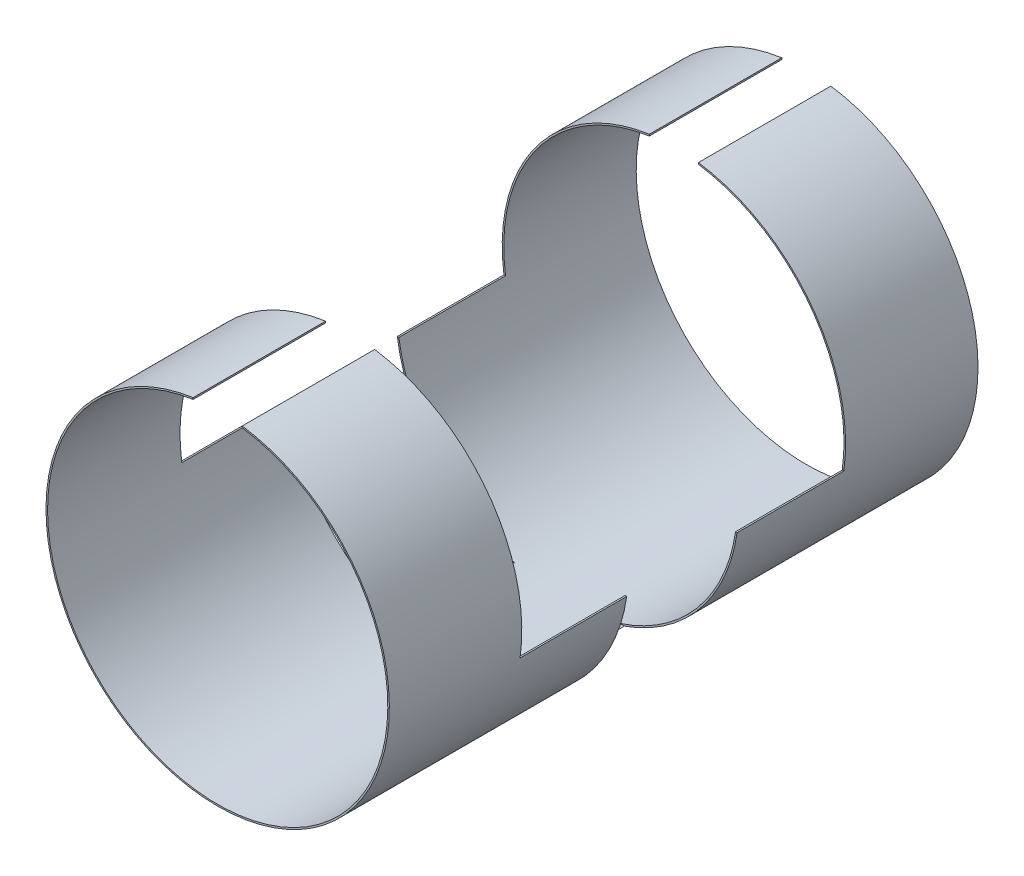
ISO-10303-21;
HEADER;
FILE_DESCRIPTION(('STEP AP214'),'2;1');
FILE_NAME('part.step','',(''),(''),'','','');
FILE_SCHEMA(('AUTOMOTIVE_DESIGN { 1 0 10303 214 1 1 1 1 }'));
ENDSEC;
DATA;
#1=APPLICATION_CONTEXT('core data for automotive mechanical design processes');
#2=APPLICATION_PROTOCOL_DEFINITION('international standard','automotive_design',2000,#1);
#3=PRODUCT_CONTEXT('',#1,'mechanical');
#4=PRODUCT('Part','Part','',(#3));
#5=PRODUCT_RELATED_PRODUCT_CATEGORY('part','',(#4));
#6=PRODUCT_DEFINITION_FORMATION('','',#4);
#7=PRODUCT_DEFINITION_CONTEXT('part definition',#1,'design');
#8=PRODUCT_DEFINITION('design','',#6,#7);
#9=PRODUCT_DEFINITION_SHAPE('','',#8);
#10=(LENGTH_UNIT() NAMED_UNIT(*) SI_UNIT(.MILLI.,.METRE.));
#11=(NAMED_UNIT(*) PLANE_ANGLE_UNIT() SI_UNIT($,.RADIAN.));
#12=(NAMED_UNIT(*) SI_UNIT($,.STERADIAN.) SOLID_ANGLE_UNIT());
#13=UNCERTAINTY_MEASURE_WITH_UNIT(LENGTH_MEASURE(1.E-05),#10,'distance_accuracy_value','');
#14=(GEOMETRIC_REPRESENTATION_CONTEXT(3) GLOBAL_UNCERTAINTY_ASSIGNED_CONTEXT((#13)) GLOBAL_UNIT_ASSIGNED_CONTEXT((#10,
#11,#12)) REPRESENTATION_CONTEXT('',''));
#15=CARTESIAN_POINT('',(0.,0.,0.));
#16=DIRECTION('',(0.,0.,1.));
#17=DIRECTION('',(1.,0.,0.));
#18=AXIS2_PLACEMENT_3D('',#15,#16,#17);
#19=CARTESIAN_POINT('',(-152.4,-6.34999999999999,118.11));
#20=DIRECTION('',(0.,-1.,0.));
#21=DIRECTION('',(0.,0.,-1.));
#22=AXIS2_PLACEMENT_3D('',#19,#20,#21);
#23=PLANE('',#22);
#24=DIRECTION('',(0.,0.,-1.));
#25=VECTOR('',#24,1.);
#26=CARTESIAN_POINT('',(43.9940905122495,-6.34999999999999,152.4));
#27=LINE('',#26,#25);
#28=CARTESIAN_POINT('',(43.9940905122494,-6.34999999999999,90.4875));
#29=VERTEX_POINT('',#28);
#30=CARTESIAN_POINT('',(43.9940905122494,-6.34999999999999,118.11));
#31=VERTEX_POINT('',#30);
#32=EDGE_CURVE('E197',#29,#31,#27,.F.);
#33=ORIENTED_EDGE('',*,*,#32,.F.);
#34=DIRECTION('',(1.,0.,0.));
#35=VECTOR('',#34,1.);
#36=CARTESIAN_POINT('',(-152.4,-6.34999999999999,90.4875));
#37=LINE('',#36,#35);
#38=CARTESIAN_POINT('',(43.5834395264989,-6.34999999999999,90.4875));
#39=VERTEX_POINT('',#38);
#40=EDGE_CURVE('E327',#39,#29,#37,.T.);
#41=ORIENTED_EDGE('',*,*,#40,.F.);
#42=DIRECTION('',(0.,0.,-1.));
#43=VECTOR('',#42,1.);
#44=CARTESIAN_POINT('',(43.583439526499,-6.34999999999999,152.4));
#45=LINE('',#44,#43);
#46=CARTESIAN_POINT('',(43.583439526499,-6.34999999999999,118.11));
#47=VERTEX_POINT('',#46);
#48=EDGE_CURVE('E246',#39,#47,#45,.F.);
#49=ORIENTED_EDGE('',*,*,#48,.T.);
#50=DIRECTION('',(1.,0.,0.));
#51=VECTOR('',#50,1.);
#52=CARTESIAN_POINT('',(-152.4,-6.34999999999999,118.11));
#53=LINE('',#52,#51);
#54=EDGE_CURVE('E287',#47,#31,#53,.T.);
#55=ORIENTED_EDGE('',*,*,#54,.T.);
#56=EDGE_LOOP('',(#33,#41,#49,#55));
#57=FACE_BOUND('',#56,.T.);
#58=ADVANCED_FACE('F32',(#57),#23,.F.);
#59=DIRECTION('',(0.,0.,-1.));
#60=VECTOR('',#59,1.);
#61=CARTESIAN_POINT('',(-43.583439526499,-6.34999999999999,152.4));
#62=LINE('',#61,#60);
#63=CARTESIAN_POINT('',(-43.5834395264991,-6.34999999999999,118.11));
#64=VERTEX_POINT('',#63);
#65=CARTESIAN_POINT('',(-43.5834395264991,-6.34999999999999,90.4875));
#66=VERTEX_POINT('',#65);
#67=EDGE_CURVE('E176',#64,#66,#62,.T.);
#68=ORIENTED_EDGE('',*,*,#67,.T.);
#69=DIRECTION('',(-1.,0.,0.));
#70=VECTOR('',#69,1.);
#71=CARTESIAN_POINT('',(-152.4,-6.34999999999999,90.4875));
#72=LINE('',#71,#70);
#73=CARTESIAN_POINT('',(-43.9940905122495,-6.34999999999999,90.4875));
#74=VERTEX_POINT('',#73);
#75=EDGE_CURVE('E175',#66,#74,#72,.T.);
#76=ORIENTED_EDGE('',*,*,#75,.T.);
#77=DIRECTION('',(0.,0.,-1.));
#78=VECTOR('',#77,1.);
#79=CARTESIAN_POINT('',(-43.9940905122495,-6.34999999999999,152.4));
#80=LINE('',#79,#78);
#81=CARTESIAN_POINT('',(-43.9940905122495,-6.34999999999999,118.11));
#82=VERTEX_POINT('',#81);
#83=EDGE_CURVE('E192',#82,#74,#80,.T.);
#84=ORIENTED_EDGE('',*,*,#83,.F.);
#85=EDGE_CURVE('E291',#82,#64,#53,.T.);
#86=ORIENTED_EDGE('',*,*,#85,.T.);
#87=EDGE_LOOP('',(#68,#76,#84,#86));
#88=FACE_BOUND('',#87,.T.);
#89=ADVANCED_FACE('F371',(#88),#23,.F.);
#90=CARTESIAN_POINT('',(-6.35,43.9940905122495,0.));
#91=DIRECTION('',(-1.,0.,0.));
#92=DIRECTION('',(0.,-1.,0.));
#93=AXIS2_PLACEMENT_3D('',#90,#91,#92);
#94=PLANE('',#93);
#95=DIRECTION('',(0.,0.,1.));
#96=VECTOR('',#95,1.);
#97=CARTESIAN_POINT('',(-6.35,43.583439526499,0.));
#98=LINE('',#97,#96);
#99=CARTESIAN_POINT('',(-6.35,43.583439526499,118.11));
#100=VERTEX_POINT('',#99);
#101=CARTESIAN_POINT('',(-6.35,43.583439526499,152.4));
#102=VERTEX_POINT('',#101);
#103=EDGE_CURVE('E225',#100,#102,#98,.T.);
#104=ORIENTED_EDGE('',*,*,#103,.F.);
#105=DIRECTION('',(0.,1.,0.));
#106=VECTOR('',#105,1.);
#107=CARTESIAN_POINT('',(-6.35,43.9940905122495,118.11));
#108=LINE('',#107,#106);
#109=CARTESIAN_POINT('',(-6.35,43.9940905122495,118.11));
#110=VERTEX_POINT('',#109);
#111=EDGE_CURVE('E309',#100,#110,#108,.T.);
#112=ORIENTED_EDGE('',*,*,#111,.T.);
#113=DIRECTION('',(0.,0.,1.));
#114=VECTOR('',#113,1.);
#115=CARTESIAN_POINT('',(-6.35,43.9940905122495,0.));
#116=LINE('',#115,#114);
#117=CARTESIAN_POINT('',(-6.35,43.9940905122495,152.4));
#118=VERTEX_POINT('',#117);
#119=EDGE_CURVE('E212',#110,#118,#116,.T.);
#120=ORIENTED_EDGE('',*,*,#119,.T.);
#121=DIRECTION('',(0.,-1.,0.));
#122=VECTOR('',#121,1.);
#123=CARTESIAN_POINT('',(-6.35,43.9940905122495,152.4));
#124=LINE('',#123,#122);
#125=EDGE_CURVE('E195',#118,#102,#124,.T.);
#126=ORIENTED_EDGE('',*,*,#125,.T.);
#127=EDGE_LOOP('',(#104,#112,#120,#126));
#128=FACE_BOUND('',#127,.T.);
#129=ADVANCED_FACE('F376',(#128),#94,.F.);
#130=CARTESIAN_POINT('',(6.35,43.9940905122495,0.));
#131=DIRECTION('',(1.,0.,0.));
#132=DIRECTION('',(0.,1.,0.));
#133=AXIS2_PLACEMENT_3D('',#130,#131,#132);
#134=PLANE('',#133);
#135=DIRECTION('',(0.,0.,1.));
#136=VECTOR('',#135,1.);
#137=CARTESIAN_POINT('',(6.35,43.9940905122495,0.));
#138=LINE('',#137,#136);
#139=CARTESIAN_POINT('',(6.35,43.9940905122495,118.11));
#140=VERTEX_POINT('',#139);
#141=CARTESIAN_POINT('',(6.35,43.9940905122495,152.4));
#142=VERTEX_POINT('',#141);
#143=EDGE_CURVE('E217',#140,#142,#138,.T.);
#144=ORIENTED_EDGE('',*,*,#143,.F.);
#145=DIRECTION('',(0.,-1.,0.));
#146=VECTOR('',#145,1.);
#147=CARTESIAN_POINT('',(6.35,43.9940905122495,118.11));
#148=LINE('',#147,#146);
#149=CARTESIAN_POINT('',(6.35,43.583439526499,118.11));
#150=VERTEX_POINT('',#149);
#151=EDGE_CURVE('E243',#140,#150,#148,.T.);
#152=ORIENTED_EDGE('',*,*,#151,.T.);
#153=DIRECTION('',(0.,0.,1.));
#154=VECTOR('',#153,1.);
#155=CARTESIAN_POINT('',(6.35,43.583439526499,0.));
#156=LINE('',#155,#154);
#157=CARTESIAN_POINT('',(6.35,43.583439526499,152.4));
#158=VERTEX_POINT('',#157);
#159=EDGE_CURVE('E221',#150,#158,#156,.T.);
#160=ORIENTED_EDGE('',*,*,#159,.T.);
#161=DIRECTION('',(0.,1.,0.));
#162=VECTOR('',#161,1.);
#163=CARTESIAN_POINT('',(6.35,43.9940905122495,152.4));
#164=LINE('',#163,#162);
#165=EDGE_CURVE('E203',#158,#142,#164,.T.);
#166=ORIENTED_EDGE('',*,*,#165,.T.);
#167=EDGE_LOOP('',(#144,#152,#160,#166));
#168=FACE_BOUND('',#167,.T.);
#169=ADVANCED_FACE('F477',(#168),#134,.F.);
#170=CARTESIAN_POINT('',(0.,0.,152.4));
#171=DIRECTION('',(0.,0.,1.));
#172=DIRECTION('',(1.,0.,0.));
#173=AXIS2_PLACEMENT_3D('',#170,#171,#172);
#174=PLANE('',#173);
#175=ORIENTED_EDGE('',*,*,#165,.F.);
#176=CARTESIAN_POINT('',(0.,0.,152.4));
#177=DIRECTION('',(0.,0.,1.));
#178=DIRECTION('',(1.,0.,0.));
#179=AXIS2_PLACEMENT_3D('',#176,#177,#178);
#180=CIRCLE('',#179,44.0436);
#181=EDGE_CURVE('E231',#102,#158,#180,.T.);
#182=ORIENTED_EDGE('',*,*,#181,.F.);
#183=ORIENTED_EDGE('',*,*,#125,.F.);
#184=CARTESIAN_POINT('',(0.,0.,152.4));
#185=DIRECTION('',(0.,0.,1.));
#186=DIRECTION('',(1.,0.,0.));
#187=AXIS2_PLACEMENT_3D('',#184,#185,#186);
#188=CIRCLE('',#187,44.45);
#189=EDGE_CURVE('E237',#118,#142,#188,.T.);
#190=ORIENTED_EDGE('',*,*,#189,.T.);
#191=EDGE_LOOP('',(#175,#182,#183,#190));
#192=FACE_BOUND('',#191,.T.);
#193=ADVANCED_FACE('F486',(#192),#174,.T.);
#194=CARTESIAN_POINT('',(0.,0.,0.));
#195=DIRECTION('',(0.,0.,1.));
#196=DIRECTION('',(1.,0.,0.));
#197=AXIS2_PLACEMENT_3D('',#194,#195,#196);
#198=PLANE('',#197);
#199=CARTESIAN_POINT('',(0.,0.,0.));
#200=DIRECTION('',(0.,0.,1.));
#201=DIRECTION('',(1.,0.,0.));
#202=AXIS2_PLACEMENT_3D('',#199,#200,#201);
#203=CIRCLE('',#202,44.0436);
#204=CARTESIAN_POINT('',(-6.35,43.583439526499,0.));
#205=VERTEX_POINT('',#204);
#206=CARTESIAN_POINT('',(6.35,43.583439526499,0.));
#207=VERTEX_POINT('',#206);
#208=EDGE_CURVE('E216',#205,#207,#203,.T.);
#209=ORIENTED_EDGE('',*,*,#208,.T.);
#210=DIRECTION('',(0.,1.,0.));
#211=VECTOR('',#210,1.);
#212=CARTESIAN_POINT('',(6.35,43.9940905122495,0.));
#213=LINE('',#212,#211);
#214=CARTESIAN_POINT('',(6.35,43.9940905122495,0.));
#215=VERTEX_POINT('',#214);
#216=EDGE_CURVE('E209',#207,#215,#213,.T.);
#217=ORIENTED_EDGE('',*,*,#216,.T.);
#218=CARTESIAN_POINT('',(0.,0.,0.));
#219=DIRECTION('',(0.,0.,1.));
#220=DIRECTION('',(1.,0.,0.));
#221=AXIS2_PLACEMENT_3D('',#218,#219,#220);
#222=CIRCLE('',#221,44.45);
#223=CARTESIAN_POINT('',(-6.35,43.9940905122495,0.));
#224=VERTEX_POINT('',#223);
#225=EDGE_CURVE('E234',#224,#215,#222,.T.);
#226=ORIENTED_EDGE('',*,*,#225,.F.);
#227=DIRECTION('',(0.,-1.,0.));
#228=VECTOR('',#227,1.);
#229=CARTESIAN_POINT('',(-6.35,43.9940905122495,0.));
#230=LINE('',#229,#228);
#231=EDGE_CURVE('E206',#224,#205,#230,.T.);
#232=ORIENTED_EDGE('',*,*,#231,.T.);
#233=EDGE_LOOP('',(#209,#217,#226,#232));
#234=FACE_BOUND('',#233,.T.);
#235=ADVANCED_FACE('F349',(#234),#198,.F.);
#236=CARTESIAN_POINT('',(0.,0.,152.4));
#237=DIRECTION('',(0.,0.,-1.));
#238=DIRECTION('',(-1.,0.,0.));
#239=AXIS2_PLACEMENT_3D('',#236,#237,#238);
#240=CYLINDRICAL_SURFACE('',#239,44.45);
#241=ORIENTED_EDGE('',*,*,#83,.T.);
#242=CARTESIAN_POINT('',(0.,0.,90.4875));
#243=DIRECTION('',(0.,0.,1.));
#244=DIRECTION('',(1.,0.,0.));
#245=AXIS2_PLACEMENT_3D('',#242,#243,#244);
#246=CIRCLE('',#245,44.45);
#247=CARTESIAN_POINT('',(-14.8106178129071,-41.91,90.4875));
#248=VERTEX_POINT('',#247);
#249=EDGE_CURVE('E283',#74,#248,#246,.T.);
#250=ORIENTED_EDGE('',*,*,#249,.T.);
#251=DIRECTION('',(0.,0.,-1.));
#252=VECTOR('',#251,1.);
#253=CARTESIAN_POINT('',(-14.8106178129071,-41.91,152.4));
#254=LINE('',#253,#252);
#255=CARTESIAN_POINT('',(-14.8106178129071,-41.91,61.9125));
#256=VERTEX_POINT('',#255);
#257=EDGE_CURVE('E185',#248,#256,#254,.T.);
#258=ORIENTED_EDGE('',*,*,#257,.T.);
#259=CARTESIAN_POINT('',(0.,0.,61.9125));
#260=DIRECTION('',(0.,0.,-1.));
#261=DIRECTION('',(-1.,0.,0.));
#262=AXIS2_PLACEMENT_3D('',#259,#260,#261);
#263=CIRCLE('',#262,44.45);
#264=CARTESIAN_POINT('',(-43.9940905122495,-6.34999999999999,61.9125));
#265=VERTEX_POINT('',#264);
#266=EDGE_CURVE('E170',#256,#265,#263,.T.);
#267=ORIENTED_EDGE('',*,*,#266,.T.);
#268=CARTESIAN_POINT('',(-43.9940905122495,-6.34999999999999,34.29));
#269=VERTEX_POINT('',#268);
#270=EDGE_CURVE('E182',#265,#269,#80,.T.);
#271=ORIENTED_EDGE('',*,*,#270,.T.);
#272=CARTESIAN_POINT('',(0.,0.,34.29));
#273=DIRECTION('',(0.,0.,-1.));
#274=DIRECTION('',(0.,1.,0.));
#275=AXIS2_PLACEMENT_3D('',#272,#273,#274);
#276=CIRCLE('',#275,44.45);
#277=CARTESIAN_POINT('',(-6.35,43.9940905122495,34.29));
#278=VERTEX_POINT('',#277);
#279=EDGE_CURVE('E301',#269,#278,#276,.T.);
#280=ORIENTED_EDGE('',*,*,#279,.T.);
#281=EDGE_CURVE('E226',#224,#278,#116,.T.);
#282=ORIENTED_EDGE('',*,*,#281,.F.);
#283=ORIENTED_EDGE('',*,*,#225,.T.);
#284=CARTESIAN_POINT('',(6.35,43.9940905122495,34.29));
#285=VERTEX_POINT('',#284);
#286=EDGE_CURVE('E213',#215,#285,#138,.T.);
#287=ORIENTED_EDGE('',*,*,#286,.T.);
#288=CARTESIAN_POINT('',(43.9940905122494,-6.34999999999999,34.29));
#289=VERTEX_POINT('',#288);
#290=EDGE_CURVE('E296',#285,#289,#276,.T.);
#291=ORIENTED_EDGE('',*,*,#290,.T.);
#292=CARTESIAN_POINT('',(43.9940905122495,-6.34999999999999,61.9125));
#293=VERTEX_POINT('',#292);
#294=EDGE_CURVE('E193',#289,#293,#27,.F.);
#295=ORIENTED_EDGE('',*,*,#294,.T.);
#296=CARTESIAN_POINT('',(14.810617812907,-41.91,61.9125));
#297=VERTEX_POINT('',#296);
#298=EDGE_CURVE('E47',#293,#297,#263,.T.);
#299=ORIENTED_EDGE('',*,*,#298,.T.);
#300=DIRECTION('',(0.,0.,-1.));
#301=VECTOR('',#300,1.);
#302=CARTESIAN_POINT('',(14.8106178129071,-41.91,152.4));
#303=LINE('',#302,#301);
#304=CARTESIAN_POINT('',(14.810617812907,-41.91,90.4875));
#305=VERTEX_POINT('',#304);
#306=EDGE_CURVE('E284',#297,#305,#303,.F.);
#307=ORIENTED_EDGE('',*,*,#306,.T.);
#308=EDGE_CURVE('E271',#305,#29,#246,.T.);
#309=ORIENTED_EDGE('',*,*,#308,.T.);
#310=ORIENTED_EDGE('',*,*,#32,.T.);
#311=CARTESIAN_POINT('',(0.,0.,118.11));
#312=DIRECTION('',(0.,0.,1.));
#313=DIRECTION('',(0.,-1.,0.));
#314=AXIS2_PLACEMENT_3D('',#311,#312,#313);
#315=CIRCLE('',#314,44.45);
#316=EDGE_CURVE('E306',#31,#140,#315,.T.);
#317=ORIENTED_EDGE('',*,*,#316,.T.);
#318=ORIENTED_EDGE('',*,*,#143,.T.);
#319=ORIENTED_EDGE('',*,*,#189,.F.);
#320=ORIENTED_EDGE('',*,*,#119,.F.);
#321=EDGE_CURVE('E310',#110,#82,#315,.T.);
#322=ORIENTED_EDGE('',*,*,#321,.T.);
#323=EDGE_LOOP('',(#241,#250,#258,#267,#271,#280,#282,#283,#287,#291,#295,#299,#307,#309,#310,
#317,#318,#319,#320,#322));
#324=FACE_BOUND('',#323,.T.);
#325=ADVANCED_FACE('F34',(#324),#240,.T.);
#326=CARTESIAN_POINT('',(0.,0.,152.4));
#327=DIRECTION('',(0.,0.,-1.));
#328=DIRECTION('',(-1.,0.,0.));
#329=AXIS2_PLACEMENT_3D('',#326,#327,#328);
#330=CYLINDRICAL_SURFACE('',#329,44.0436);
#331=CARTESIAN_POINT('',(0.,0.,90.4875));
#332=DIRECTION('',(0.,0.,1.));
#333=DIRECTION('',(1.,0.,0.));
#334=AXIS2_PLACEMENT_3D('',#331,#332,#333);
#335=CIRCLE('',#334,44.0436);
#336=CARTESIAN_POINT('',(-13.5421785898725,-41.91,90.4875));
#337=VERTEX_POINT('',#336);
#338=EDGE_CURVE('E278',#66,#337,#335,.T.);
#339=ORIENTED_EDGE('',*,*,#338,.F.);
#340=ORIENTED_EDGE('',*,*,#67,.F.);
#341=CARTESIAN_POINT('',(0.,0.,118.11));
#342=DIRECTION('',(0.,0.,1.));
#343=DIRECTION('',(0.,-1.,0.));
#344=AXIS2_PLACEMENT_3D('',#341,#342,#343);
#345=CIRCLE('',#344,44.0436);
#346=EDGE_CURVE('E307',#100,#64,#345,.T.);
#347=ORIENTED_EDGE('',*,*,#346,.F.);
#348=ORIENTED_EDGE('',*,*,#103,.T.);
#349=ORIENTED_EDGE('',*,*,#181,.T.);
#350=ORIENTED_EDGE('',*,*,#159,.F.);
#351=EDGE_CURVE('E304',#47,#150,#345,.T.);
#352=ORIENTED_EDGE('',*,*,#351,.F.);
#353=ORIENTED_EDGE('',*,*,#48,.F.);
#354=CARTESIAN_POINT('',(13.5421785898724,-41.91,90.4875));
#355=VERTEX_POINT('',#354);
#356=EDGE_CURVE('E268',#355,#39,#335,.T.);
#357=ORIENTED_EDGE('',*,*,#356,.F.);
#358=DIRECTION('',(0.,0.,-1.));
#359=VECTOR('',#358,1.);
#360=CARTESIAN_POINT('',(13.5421785898725,-41.91,152.4));
#361=LINE('',#360,#359);
#362=CARTESIAN_POINT('',(13.5421785898724,-41.91,61.9125));
#363=VERTEX_POINT('',#362);
#364=EDGE_CURVE('E40',#363,#355,#361,.F.);
#365=ORIENTED_EDGE('',*,*,#364,.F.);
#366=CARTESIAN_POINT('',(0.,0.,61.9125));
#367=DIRECTION('',(0.,0.,-1.));
#368=DIRECTION('',(-1.,0.,0.));
#369=AXIS2_PLACEMENT_3D('',#366,#367,#368);
#370=CIRCLE('',#369,44.0436);
#371=CARTESIAN_POINT('',(43.5834395264989,-6.34999999999999,61.9125));
#372=VERTEX_POINT('',#371);
#373=EDGE_CURVE('E186',#372,#363,#370,.T.);
#374=ORIENTED_EDGE('',*,*,#373,.F.);
#375=CARTESIAN_POINT('',(43.583439526499,-6.34999999999999,34.29));
#376=VERTEX_POINT('',#375);
#377=EDGE_CURVE('E247',#376,#372,#45,.F.);
#378=ORIENTED_EDGE('',*,*,#377,.F.);
#379=CARTESIAN_POINT('',(0.,0.,34.29));
#380=DIRECTION('',(0.,0.,-1.));
#381=DIRECTION('',(0.,1.,0.));
#382=AXIS2_PLACEMENT_3D('',#379,#380,#381);
#383=CIRCLE('',#382,44.0436);
#384=CARTESIAN_POINT('',(6.35,43.583439526499,34.29));
#385=VERTEX_POINT('',#384);
#386=EDGE_CURVE('E294',#385,#376,#383,.T.);
#387=ORIENTED_EDGE('',*,*,#386,.F.);
#388=EDGE_CURVE('E218',#207,#385,#156,.T.);
#389=ORIENTED_EDGE('',*,*,#388,.F.);
#390=ORIENTED_EDGE('',*,*,#208,.F.);
#391=CARTESIAN_POINT('',(-6.35,43.583439526499,34.29));
#392=VERTEX_POINT('',#391);
#393=EDGE_CURVE('E222',#205,#392,#98,.T.);
#394=ORIENTED_EDGE('',*,*,#393,.T.);
#395=CARTESIAN_POINT('',(-43.5834395264991,-6.34999999999999,34.29));
#396=VERTEX_POINT('',#395);
#397=EDGE_CURVE('E297',#396,#392,#383,.T.);
#398=ORIENTED_EDGE('',*,*,#397,.F.);
#399=CARTESIAN_POINT('',(-43.583439526499,-6.34999999999999,61.9125));
#400=VERTEX_POINT('',#399);
#401=EDGE_CURVE('E250',#400,#396,#62,.T.);
#402=ORIENTED_EDGE('',*,*,#401,.F.);
#403=CARTESIAN_POINT('',(-13.5421785898725,-41.91,61.9125));
#404=VERTEX_POINT('',#403);
#405=EDGE_CURVE('E55',#404,#400,#370,.T.);
#406=ORIENTED_EDGE('',*,*,#405,.F.);
#407=DIRECTION('',(0.,0.,-1.));
#408=VECTOR('',#407,1.);
#409=CARTESIAN_POINT('',(-13.5421785898725,-41.91,152.4));
#410=LINE('',#409,#408);
#411=EDGE_CURVE('E11',#337,#404,#410,.T.);
#412=ORIENTED_EDGE('',*,*,#411,.F.);
#413=EDGE_LOOP('',(#339,#340,#347,#348,#349,#350,#352,#353,#357,#365,#374,#378,#387,#389,#390,
#394,#398,#402,#406,#412));
#414=FACE_BOUND('',#413,.T.);
#415=ADVANCED_FACE('F276',(#414),#330,.F.);
#416=ORIENTED_EDGE('',*,*,#281,.T.);
#417=DIRECTION('',(0.,-1.,0.));
#418=VECTOR('',#417,1.);
#419=CARTESIAN_POINT('',(-6.35,43.9940905122495,34.29));
#420=LINE('',#419,#418);
#421=EDGE_CURVE('E300',#278,#392,#420,.T.);
#422=ORIENTED_EDGE('',*,*,#421,.T.);
#423=ORIENTED_EDGE('',*,*,#393,.F.);
#424=ORIENTED_EDGE('',*,*,#231,.F.);
#425=EDGE_LOOP('',(#416,#422,#423,#424));
#426=FACE_BOUND('',#425,.T.);
#427=ADVANCED_FACE('F346',(#426),#94,.F.);
#428=ORIENTED_EDGE('',*,*,#388,.T.);
#429=DIRECTION('',(0.,1.,0.));
#430=VECTOR('',#429,1.);
#431=CARTESIAN_POINT('',(6.35,43.9940905122495,34.29));
#432=LINE('',#431,#430);
#433=EDGE_CURVE('E240',#385,#285,#432,.T.);
#434=ORIENTED_EDGE('',*,*,#433,.T.);
#435=ORIENTED_EDGE('',*,*,#286,.F.);
#436=ORIENTED_EDGE('',*,*,#216,.F.);
#437=EDGE_LOOP('',(#428,#434,#435,#436));
#438=FACE_BOUND('',#437,.T.);
#439=ADVANCED_FACE('F354',(#438),#134,.F.);
#440=CARTESIAN_POINT('',(-152.4,69.85,118.11));
#441=DIRECTION('',(0.,0.,1.));
#442=DIRECTION('',(0.,-1.,0.));
#443=AXIS2_PLACEMENT_3D('',#440,#441,#442);
#444=PLANE('',#443);
#445=ORIENTED_EDGE('',*,*,#54,.F.);
#446=ORIENTED_EDGE('',*,*,#351,.T.);
#447=ORIENTED_EDGE('',*,*,#151,.F.);
#448=ORIENTED_EDGE('',*,*,#316,.F.);
#449=EDGE_LOOP('',(#445,#446,#447,#448));
#450=FACE_BOUND('',#449,.T.);
#451=ADVANCED_FACE('F326',(#450),#444,.F.);
#452=CARTESIAN_POINT('',(-152.4,69.85,34.29));
#453=DIRECTION('',(0.,0.,-1.));
#454=DIRECTION('',(0.,1.,0.));
#455=AXIS2_PLACEMENT_3D('',#452,#453,#454);
#456=PLANE('',#455);
#457=ORIENTED_EDGE('',*,*,#433,.F.);
#458=ORIENTED_EDGE('',*,*,#386,.T.);
#459=DIRECTION('',(1.,0.,0.));
#460=VECTOR('',#459,1.);
#461=CARTESIAN_POINT('',(-152.4,-6.34999999999999,34.29));
#462=LINE('',#461,#460);
#463=EDGE_CURVE('E288',#376,#289,#462,.T.);
#464=ORIENTED_EDGE('',*,*,#463,.T.);
#465=ORIENTED_EDGE('',*,*,#290,.F.);
#466=EDGE_LOOP('',(#457,#458,#464,#465));
#467=FACE_BOUND('',#466,.T.);
#468=ADVANCED_FACE('F356',(#467),#456,.F.);
#469=ORIENTED_EDGE('',*,*,#377,.T.);
#470=DIRECTION('',(1.,0.,0.));
#471=VECTOR('',#470,1.);
#472=CARTESIAN_POINT('',(-152.4,-6.34999999999999,61.9125));
#473=LINE('',#472,#471);
#474=EDGE_CURVE('E328',#372,#293,#473,.T.);
#475=ORIENTED_EDGE('',*,*,#474,.T.);
#476=ORIENTED_EDGE('',*,*,#294,.F.);
#477=ORIENTED_EDGE('',*,*,#463,.F.);
#478=EDGE_LOOP('',(#469,#475,#476,#477));
#479=FACE_BOUND('',#478,.T.);
#480=ADVANCED_FACE('F359',(#479),#23,.F.);
#481=ORIENTED_EDGE('',*,*,#270,.F.);
#482=DIRECTION('',(1.,0.,0.));
#483=VECTOR('',#482,1.);
#484=CARTESIAN_POINT('',(-152.4,-6.34999999999999,61.9125));
#485=LINE('',#484,#483);
#486=EDGE_CURVE('E167',#265,#400,#485,.T.);
#487=ORIENTED_EDGE('',*,*,#486,.T.);
#488=ORIENTED_EDGE('',*,*,#401,.T.);
#489=EDGE_CURVE('E191',#269,#396,#462,.T.);
#490=ORIENTED_EDGE('',*,*,#489,.F.);
#491=EDGE_LOOP('',(#481,#487,#488,#490));
#492=FACE_BOUND('',#491,.T.);
#493=ADVANCED_FACE('F189',(#492),#23,.F.);
#494=ORIENTED_EDGE('',*,*,#111,.F.);
#495=ORIENTED_EDGE('',*,*,#346,.T.);
#496=ORIENTED_EDGE('',*,*,#85,.F.);
#497=ORIENTED_EDGE('',*,*,#321,.F.);
#498=EDGE_LOOP('',(#494,#495,#496,#497));
#499=FACE_BOUND('',#498,.T.);
#500=ADVANCED_FACE('F381',(#499),#444,.F.);
#501=ORIENTED_EDGE('',*,*,#489,.T.);
#502=ORIENTED_EDGE('',*,*,#397,.T.);
#503=ORIENTED_EDGE('',*,*,#421,.F.);
#504=ORIENTED_EDGE('',*,*,#279,.F.);
#505=EDGE_LOOP('',(#501,#502,#503,#504));
#506=FACE_BOUND('',#505,.T.);
#507=ADVANCED_FACE('F342',(#506),#456,.F.);
#508=CARTESIAN_POINT('',(-152.4,-6.34999999999999,61.9125));
#509=DIRECTION('',(0.,0.,-1.));
#510=DIRECTION('',(-1.,0.,0.));
#511=AXIS2_PLACEMENT_3D('',#508,#509,#510);
#512=PLANE('',#511);
#513=DIRECTION('',(1.,0.,0.));
#514=VECTOR('',#513,1.);
#515=CARTESIAN_POINT('',(-152.4,-41.91,61.9125));
#516=LINE('',#515,#514);
#517=EDGE_CURVE('E330',#256,#404,#516,.T.);
#518=ORIENTED_EDGE('',*,*,#517,.T.);
#519=ORIENTED_EDGE('',*,*,#405,.T.);
#520=ORIENTED_EDGE('',*,*,#486,.F.);
#521=ORIENTED_EDGE('',*,*,#266,.F.);
#522=EDGE_LOOP('',(#518,#519,#520,#521));
#523=FACE_BOUND('',#522,.T.);
#524=ADVANCED_FACE('F169',(#523),#512,.F.);
#525=CARTESIAN_POINT('',(-152.4,-6.34999999999999,90.4875));
#526=DIRECTION('',(0.,0.,1.));
#527=DIRECTION('',(1.,0.,0.));
#528=AXIS2_PLACEMENT_3D('',#525,#526,#527);
#529=PLANE('',#528);
#530=ORIENTED_EDGE('',*,*,#75,.F.);
#531=ORIENTED_EDGE('',*,*,#338,.T.);
#532=DIRECTION('',(1.,0.,0.));
#533=VECTOR('',#532,1.);
#534=CARTESIAN_POINT('',(-152.4,-41.91,90.4875));
#535=LINE('',#534,#533);
#536=EDGE_CURVE('E272',#248,#337,#535,.T.);
#537=ORIENTED_EDGE('',*,*,#536,.F.);
#538=ORIENTED_EDGE('',*,*,#249,.F.);
#539=EDGE_LOOP('',(#530,#531,#537,#538));
#540=FACE_BOUND('',#539,.T.);
#541=ADVANCED_FACE('F367',(#540),#529,.F.);
#542=CARTESIAN_POINT('',(-152.4,-41.91,90.4875));
#543=DIRECTION('',(0.,-1.,0.));
#544=DIRECTION('',(0.,0.,-1.));
#545=AXIS2_PLACEMENT_3D('',#542,#543,#544);
#546=PLANE('',#545);
#547=ORIENTED_EDGE('',*,*,#536,.T.);
#548=ORIENTED_EDGE('',*,*,#411,.T.);
#549=ORIENTED_EDGE('',*,*,#517,.F.);
#550=ORIENTED_EDGE('',*,*,#257,.F.);
#551=EDGE_LOOP('',(#547,#548,#549,#550));
#552=FACE_BOUND('',#551,.T.);
#553=ADVANCED_FACE('F337',(#552),#546,.F.);
#554=EDGE_CURVE('E262',#363,#297,#516,.T.);
#555=ORIENTED_EDGE('',*,*,#554,.F.);
#556=ORIENTED_EDGE('',*,*,#364,.T.);
#557=EDGE_CURVE('E260',#355,#305,#535,.T.);
#558=ORIENTED_EDGE('',*,*,#557,.T.);
#559=ORIENTED_EDGE('',*,*,#306,.F.);
#560=EDGE_LOOP('',(#555,#556,#558,#559));
#561=FACE_BOUND('',#560,.T.);
#562=ADVANCED_FACE('F259',(#561),#546,.F.);
#563=ORIENTED_EDGE('',*,*,#557,.F.);
#564=ORIENTED_EDGE('',*,*,#356,.T.);
#565=ORIENTED_EDGE('',*,*,#40,.T.);
#566=ORIENTED_EDGE('',*,*,#308,.F.);
#567=EDGE_LOOP('',(#563,#564,#565,#566));
#568=FACE_BOUND('',#567,.T.);
#569=ADVANCED_FACE('F267',(#568),#529,.F.);
#570=ORIENTED_EDGE('',*,*,#474,.F.);
#571=ORIENTED_EDGE('',*,*,#373,.T.);
#572=ORIENTED_EDGE('',*,*,#554,.T.);
#573=ORIENTED_EDGE('',*,*,#298,.F.);
#574=EDGE_LOOP('',(#570,#571,#572,#573));
#575=FACE_BOUND('',#574,.T.);
#576=ADVANCED_FACE('F360',(#575),#512,.F.);
#577=CLOSED_SHELL('',(#58,#89,#129,#169,#193,#235,#325,#415,#427,#439,#451,#468,#480,#493,#500,
#507,#524,#541,#553,#562,#569,#576));
#578=MANIFOLD_SOLID_BREP('B2',#577);
#579=ADVANCED_BREP_SHAPE_REPRESENTATION('',(#18,#578),#14);
#580=SHAPE_DEFINITION_REPRESENTATION(#9,#579);
ENDSEC;
END-ISO-10303-21;
